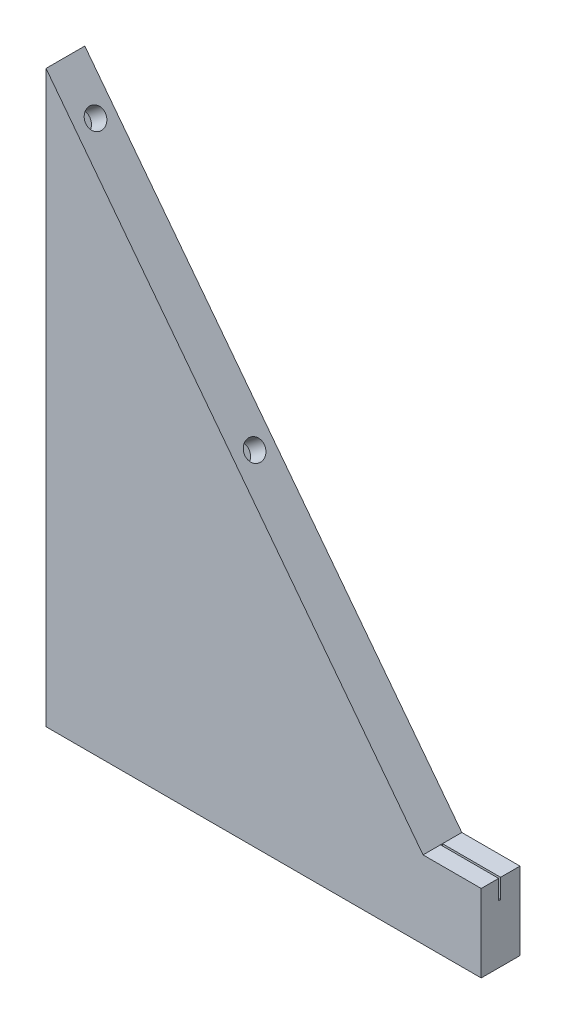
ISO-10303-21;
HEADER;
FILE_DESCRIPTION(('STEP AP214'),'2;1');
FILE_NAME('part.step','',(''),(''),'','','');
FILE_SCHEMA(('AUTOMOTIVE_DESIGN { 1 0 10303 214 1 1 1 1 }'));
ENDSEC;
DATA;
#1=APPLICATION_CONTEXT('core data for automotive mechanical design processes');
#2=APPLICATION_PROTOCOL_DEFINITION('international standard','automotive_design',2000,#1);
#3=PRODUCT_CONTEXT('',#1,'mechanical');
#4=PRODUCT('Part','Part','',(#3));
#5=PRODUCT_RELATED_PRODUCT_CATEGORY('part','',(#4));
#6=PRODUCT_DEFINITION_FORMATION('','',#4);
#7=PRODUCT_DEFINITION_CONTEXT('part definition',#1,'design');
#8=PRODUCT_DEFINITION('design','',#6,#7);
#9=PRODUCT_DEFINITION_SHAPE('','',#8);
#10=(LENGTH_UNIT() NAMED_UNIT(*) SI_UNIT(.MILLI.,.METRE.));
#11=(NAMED_UNIT(*) PLANE_ANGLE_UNIT() SI_UNIT($,.RADIAN.));
#12=(NAMED_UNIT(*) SI_UNIT($,.STERADIAN.) SOLID_ANGLE_UNIT());
#13=UNCERTAINTY_MEASURE_WITH_UNIT(LENGTH_MEASURE(1.E-05),#10,'distance_accuracy_value','');
#14=(GEOMETRIC_REPRESENTATION_CONTEXT(3) GLOBAL_UNCERTAINTY_ASSIGNED_CONTEXT((#13)) GLOBAL_UNIT_ASSIGNED_CONTEXT((#10,
#11,#12)) REPRESENTATION_CONTEXT('',''));
#15=CARTESIAN_POINT('',(0.,0.,0.));
#16=DIRECTION('',(0.,0.,1.));
#17=DIRECTION('',(1.,0.,0.));
#18=AXIS2_PLACEMENT_3D('',#15,#16,#17);
#19=CARTESIAN_POINT('',(61.7516378344647,-67.9802034253826,12.6999999999998));
#20=DIRECTION('',(0.,-1.,0.));
#21=DIRECTION('',(1.,0.,0.));
#22=AXIS2_PLACEMENT_3D('',#19,#20,#21);
#23=PLANE('',#22);
#24=DIRECTION('',(0.,0.,-0.999999999999995));
#25=VECTOR('',#24,1.);
#26=CARTESIAN_POINT('',(61.7516378344647,-67.9802034253826,12.6999999999998));
#27=LINE('',#26,#25);
#28=CARTESIAN_POINT('',(61.751637834465,-67.9802034253823,6.34999999999981));
#29=VERTEX_POINT('',#28);
#30=CARTESIAN_POINT('',(61.7516378344647,-67.9802034253825,-1.52655665885959E-13));
#31=VERTEX_POINT('',#30);
#32=EDGE_CURVE('E92',#29,#31,#27,.T.);
#33=ORIENTED_EDGE('',*,*,#32,.F.);
#34=DIRECTION('',(-1.,0.,0.));
#35=VECTOR('',#34,1.);
#36=CARTESIAN_POINT('',(61.751637834465,-67.9802034253823,6.34999999999981));
#37=LINE('',#36,#35);
#38=CARTESIAN_POINT('',(80.8016378344648,-67.9802034253826,6.34999999999985));
#39=VERTEX_POINT('',#38);
#40=EDGE_CURVE('E165',#39,#29,#37,.T.);
#41=ORIENTED_EDGE('',*,*,#40,.F.);
#42=DIRECTION('',(0.,0.,-0.999999999999995));
#43=VECTOR('',#42,1.);
#44=CARTESIAN_POINT('',(80.8016378344652,-67.9802034253827,12.6999999999998));
#45=LINE('',#44,#43);
#46=CARTESIAN_POINT('',(80.8016378344648,-67.9802034253826,-1.14491749414469E-13));
#47=VERTEX_POINT('',#46);
#48=EDGE_CURVE('E148',#39,#47,#45,.T.);
#49=ORIENTED_EDGE('',*,*,#48,.T.);
#50=DIRECTION('',(-1.,0.,0.));
#51=VECTOR('',#50,1.);
#52=CARTESIAN_POINT('',(61.7516378344647,-67.9802034253825,-1.52655665885959E-13));
#53=LINE('',#52,#51);
#54=EDGE_CURVE('E142',#47,#31,#53,.T.);
#55=ORIENTED_EDGE('',*,*,#54,.T.);
#56=EDGE_LOOP('',(#33,#41,#49,#55));
#57=FACE_BOUND('',#56,.T.);
#58=ADVANCED_FACE('F44',(#57),#23,.F.);
#59=CARTESIAN_POINT('',(61.7516378344647,-67.9802034253826,12.6999999999998));
#60=DIRECTION('',(-0.794096490407309,-0.607791710969138,0.));
#61=DIRECTION('',(0.607791710969143,-0.794096490407309,0.));
#62=AXIS2_PLACEMENT_3D('',#59,#60,#61);
#63=PLANE('',#62);
#64=CARTESIAN_POINT('',(0.,12.7,6.12865130173663));
#65=DIRECTION('',(0.794096490407309,0.607791710969137,0.));
#66=DIRECTION('',(-0.607791710969142,0.79409649040731,0.));
#67=AXIS2_PLACEMENT_3D('',#64,#65,#66);
#68=CIRCLE('',#67,3.175);
#69=CARTESIAN_POINT('',(-1.92973868232704,15.2212563570432,6.12865130173664));
#70=VERTEX_POINT('',#69);
#71=EDGE_CURVE('E180',#70,#70,#68,.T.);
#72=ORIENTED_EDGE('',*,*,#71,.F.);
#73=EDGE_LOOP('',(#72));
#74=FACE_BOUND('',#73,.T.);
#75=CARTESIAN_POINT('',(-52.1029444228296,80.7739216401665,6.12865130173684));
#76=DIRECTION('',(0.794096490407309,0.607791710969137,0.));
#77=DIRECTION('',(-0.607791710969142,0.79409649040731,0.));
#78=AXIS2_PLACEMENT_3D('',#75,#76,#77);
#79=CIRCLE('',#78,3.175);
#80=CARTESIAN_POINT('',(-54.0326831051566,83.2951779972097,6.12865130173687));
#81=VERTEX_POINT('',#80);
#82=EDGE_CURVE('E190',#81,#81,#79,.T.);
#83=ORIENTED_EDGE('',*,*,#82,.F.);
#84=EDGE_LOOP('',(#83));
#85=FACE_BOUND('',#84,.T.);
#86=DIRECTION('',(-0.607791710969143,0.794096490407309,0.));
#87=VECTOR('',#86,1.);
#88=CARTESIAN_POINT('',(61.7516378344647,-67.9802034253825,-1.52655665885959E-13));
#89=LINE('',#88,#87);
#90=CARTESIAN_POINT('',(-61.7516378344649,93.3802034253826,3.43475248243408E-13));
#91=VERTEX_POINT('',#90);
#92=EDGE_CURVE('E133',#31,#91,#89,.T.);
#93=ORIENTED_EDGE('',*,*,#92,.T.);
#94=DIRECTION('',(0.,0.,-0.999999999999995));
#95=VECTOR('',#94,1.);
#96=CARTESIAN_POINT('',(-61.7516378344648,93.3802034253826,12.7000000000003));
#97=LINE('',#96,#95);
#98=CARTESIAN_POINT('',(-61.7516378344648,93.3802034253826,12.7000000000003));
#99=VERTEX_POINT('',#98);
#100=EDGE_CURVE('E13',#99,#91,#97,.T.);
#101=ORIENTED_EDGE('',*,*,#100,.F.);
#102=DIRECTION('',(-0.607791710969143,0.794096490407309,0.));
#103=VECTOR('',#102,1.);
#104=CARTESIAN_POINT('',(61.7516378344647,-67.9802034253826,12.6999999999998));
#105=LINE('',#104,#103);
#106=CARTESIAN_POINT('',(61.7516378344647,-67.9802034253826,12.6999999999998));
#107=VERTEX_POINT('',#106);
#108=EDGE_CURVE('E144',#107,#99,#105,.T.);
#109=ORIENTED_EDGE('',*,*,#108,.F.);
#110=CARTESIAN_POINT('',(61.751637834465,-67.9802034253824,6.98499999999979));
#111=VERTEX_POINT('',#110);
#112=EDGE_CURVE('E145',#107,#111,#27,.T.);
#113=ORIENTED_EDGE('',*,*,#112,.T.);
#114=DIRECTION('',(0.,0.,0.999999999999995));
#115=VECTOR('',#114,1.);
#116=CARTESIAN_POINT('',(61.751637834465,-67.9802034253824,6.98499999999979));
#117=LINE('',#116,#115);
#118=EDGE_CURVE('E59',#29,#111,#117,.T.);
#119=ORIENTED_EDGE('',*,*,#118,.F.);
#120=ORIENTED_EDGE('',*,*,#32,.T.);
#121=EDGE_LOOP('',(#93,#101,#109,#113,#119,#120));
#122=FACE_BOUND('',#121,.T.);
#123=ADVANCED_FACE('F46',(#74,#85,#122),#63,.F.);
#124=CARTESIAN_POINT('',(-61.7516378344648,93.3802034253826,12.7000000000003));
#125=DIRECTION('',(1.,0.,0.));
#126=DIRECTION('',(0.,1.,0.));
#127=AXIS2_PLACEMENT_3D('',#124,#125,#126);
#128=PLANE('',#127);
#129=DIRECTION('',(0.,-1.,0.));
#130=VECTOR('',#129,1.);
#131=CARTESIAN_POINT('',(-61.7516378344649,93.3802034253826,3.43475248243408E-13));
#132=LINE('',#131,#130);
#133=CARTESIAN_POINT('',(-61.7516378344646,-93.3802034253825,-6.10622663543836E-13));
#134=VERTEX_POINT('',#133);
#135=EDGE_CURVE('E135',#91,#134,#132,.T.);
#136=ORIENTED_EDGE('',*,*,#135,.T.);
#137=DIRECTION('',(0.,0.,-0.999999999999995));
#138=VECTOR('',#137,1.);
#139=CARTESIAN_POINT('',(-61.7516378344647,-93.3802034253825,12.6999999999994));
#140=LINE('',#139,#138);
#141=CARTESIAN_POINT('',(-61.7516378344647,-93.3802034253825,12.6999999999994));
#142=VERTEX_POINT('',#141);
#143=EDGE_CURVE('E52',#142,#134,#140,.T.);
#144=ORIENTED_EDGE('',*,*,#143,.F.);
#145=DIRECTION('',(0.,-1.,0.));
#146=VECTOR('',#145,1.);
#147=CARTESIAN_POINT('',(-61.7516378344648,93.3802034253826,12.7000000000003));
#148=LINE('',#147,#146);
#149=EDGE_CURVE('E100',#99,#142,#148,.T.);
#150=ORIENTED_EDGE('',*,*,#149,.F.);
#151=ORIENTED_EDGE('',*,*,#100,.T.);
#152=EDGE_LOOP('',(#136,#144,#150,#151));
#153=FACE_BOUND('',#152,.T.);
#154=ADVANCED_FACE('F149',(#153),#128,.F.);
#155=CARTESIAN_POINT('',(80.8016378344647,-93.3802034253825,12.6999999999997));
#156=DIRECTION('',(0.,1.,0.));
#157=DIRECTION('',(-1.,0.,0.));
#158=AXIS2_PLACEMENT_3D('',#155,#156,#157);
#159=PLANE('',#158);
#160=CARTESIAN_POINT('',(48.099478088129,-93.3802034253826,6.34999999999966));
#161=DIRECTION('',(0.,-1.,0.));
#162=DIRECTION('',(0.,0.,-0.999999999999995));
#163=AXIS2_PLACEMENT_3D('',#160,#161,#162);
#164=CIRCLE('',#163,3.175);
#165=CARTESIAN_POINT('',(48.0994780881289,-93.3802034253825,3.17499999999965));
#166=VERTEX_POINT('',#165);
#167=EDGE_CURVE('E196',#166,#166,#164,.T.);
#168=ORIENTED_EDGE('',*,*,#167,.F.);
#169=EDGE_LOOP('',(#168));
#170=FACE_BOUND('',#169,.T.);
#171=CARTESIAN_POINT('',(-53.5005219118714,-93.3802034253826,6.34999999999943));
#172=DIRECTION('',(0.,-1.,0.));
#173=DIRECTION('',(0.,0.,-0.999999999999995));
#174=AXIS2_PLACEMENT_3D('',#171,#172,#173);
#175=CIRCLE('',#174,3.175);
#176=CARTESIAN_POINT('',(-53.5005219118713,-93.3802034253826,3.17499999999942));
#177=VERTEX_POINT('',#176);
#178=EDGE_CURVE('E202',#177,#177,#175,.T.);
#179=ORIENTED_EDGE('',*,*,#178,.F.);
#180=EDGE_LOOP('',(#179));
#181=FACE_BOUND('',#180,.T.);
#182=DIRECTION('',(1.,0.,0.));
#183=VECTOR('',#182,1.);
#184=CARTESIAN_POINT('',(80.8016378344648,-93.3802034253826,-3.05311331771918E-13));
#185=LINE('',#184,#183);
#186=CARTESIAN_POINT('',(80.8016378344648,-93.3802034253826,-3.05311331771918E-13));
#187=VERTEX_POINT('',#186);
#188=EDGE_CURVE('E119',#134,#187,#185,.T.);
#189=ORIENTED_EDGE('',*,*,#188,.T.);
#190=DIRECTION('',(0.,0.,-0.999999999999995));
#191=VECTOR('',#190,1.);
#192=CARTESIAN_POINT('',(80.8016378344647,-93.3802034253825,12.6999999999997));
#193=LINE('',#192,#191);
#194=CARTESIAN_POINT('',(80.8016378344647,-93.3802034253825,12.6999999999997));
#195=VERTEX_POINT('',#194);
#196=EDGE_CURVE('E117',#195,#187,#193,.T.);
#197=ORIENTED_EDGE('',*,*,#196,.F.);
#198=DIRECTION('',(1.,0.,0.));
#199=VECTOR('',#198,1.);
#200=CARTESIAN_POINT('',(-61.7516378344647,-93.3802034253825,12.6999999999994));
#201=LINE('',#200,#199);
#202=EDGE_CURVE('E107',#142,#195,#201,.T.);
#203=ORIENTED_EDGE('',*,*,#202,.F.);
#204=ORIENTED_EDGE('',*,*,#143,.T.);
#205=EDGE_LOOP('',(#189,#197,#203,#204));
#206=FACE_BOUND('',#205,.T.);
#207=ADVANCED_FACE('F118',(#170,#181,#206),#159,.F.);
#208=CARTESIAN_POINT('',(80.8016378344652,-67.9802034253827,12.6999999999998));
#209=DIRECTION('',(-1.,0.,0.));
#210=DIRECTION('',(0.,0.,0.999999999999995));
#211=AXIS2_PLACEMENT_3D('',#208,#209,#210);
#212=PLANE('',#211);
#213=ORIENTED_EDGE('',*,*,#48,.F.);
#214=DIRECTION('',(0.,1.,0.));
#215=VECTOR('',#214,1.);
#216=CARTESIAN_POINT('',(80.8016378344653,-74.3302034253824,6.34999999999983));
#217=LINE('',#216,#215);
#218=CARTESIAN_POINT('',(80.8016378344653,-74.3302034253824,6.34999999999983));
#219=VERTEX_POINT('',#218);
#220=EDGE_CURVE('E160',#219,#39,#217,.T.);
#221=ORIENTED_EDGE('',*,*,#220,.F.);
#222=DIRECTION('',(0.,0.,-0.999999999999995));
#223=VECTOR('',#222,1.);
#224=CARTESIAN_POINT('',(80.8016378344648,-74.3302034253825,6.98499999999981));
#225=LINE('',#224,#223);
#226=CARTESIAN_POINT('',(80.8016378344648,-74.3302034253825,6.98499999999981));
#227=VERTEX_POINT('',#226);
#228=EDGE_CURVE('E375',#227,#219,#225,.T.);
#229=ORIENTED_EDGE('',*,*,#228,.F.);
#230=DIRECTION('',(0.,1.,0.));
#231=VECTOR('',#230,1.);
#232=CARTESIAN_POINT('',(80.8016378344648,-74.3302034253825,6.98499999999981));
#233=LINE('',#232,#231);
#234=CARTESIAN_POINT('',(80.8016378344653,-67.9802034253828,6.98499999999984));
#235=VERTEX_POINT('',#234);
#236=EDGE_CURVE('E182',#227,#235,#233,.T.);
#237=ORIENTED_EDGE('',*,*,#236,.T.);
#238=CARTESIAN_POINT('',(80.8016378344652,-67.9802034253827,12.6999999999998));
#239=VERTEX_POINT('',#238);
#240=EDGE_CURVE('E123',#239,#235,#45,.T.);
#241=ORIENTED_EDGE('',*,*,#240,.F.);
#242=DIRECTION('',(0.,1.,0.));
#243=VECTOR('',#242,1.);
#244=CARTESIAN_POINT('',(80.8016378344652,-67.9802034253827,12.6999999999998));
#245=LINE('',#244,#243);
#246=EDGE_CURVE('E111',#195,#239,#245,.T.);
#247=ORIENTED_EDGE('',*,*,#246,.F.);
#248=ORIENTED_EDGE('',*,*,#196,.T.);
#249=DIRECTION('',(0.,1.,0.));
#250=VECTOR('',#249,1.);
#251=CARTESIAN_POINT('',(80.8016378344648,-67.9802034253826,-1.14491749414469E-13));
#252=LINE('',#251,#250);
#253=EDGE_CURVE('E140',#187,#47,#252,.T.);
#254=ORIENTED_EDGE('',*,*,#253,.T.);
#255=EDGE_LOOP('',(#213,#221,#229,#237,#241,#247,#248,#254));
#256=FACE_BOUND('',#255,.T.);
#257=ADVANCED_FACE('F126',(#256),#212,.F.);
#258=ORIENTED_EDGE('',*,*,#240,.T.);
#259=DIRECTION('',(1.,0.,0.));
#260=VECTOR('',#259,1.);
#261=CARTESIAN_POINT('',(61.751637834465,-67.9802034253824,6.98499999999979));
#262=LINE('',#261,#260);
#263=EDGE_CURVE('E169',#111,#235,#262,.T.);
#264=ORIENTED_EDGE('',*,*,#263,.F.);
#265=ORIENTED_EDGE('',*,*,#112,.F.);
#266=DIRECTION('',(-1.,0.,0.));
#267=VECTOR('',#266,1.);
#268=CARTESIAN_POINT('',(61.7516378344647,-67.9802034253826,12.6999999999998));
#269=LINE('',#268,#267);
#270=EDGE_CURVE('E68',#239,#107,#269,.T.);
#271=ORIENTED_EDGE('',*,*,#270,.F.);
#272=EDGE_LOOP('',(#258,#264,#265,#271));
#273=FACE_BOUND('',#272,.T.);
#274=ADVANCED_FACE('F217',(#273),#23,.F.);
#275=CARTESIAN_POINT('',(81.1924862012643,-93.3802034253825,12.6999999999997));
#276=DIRECTION('',(0.,0.,-0.999999999999995));
#277=DIRECTION('',(-1.,0.,0.));
#278=AXIS2_PLACEMENT_3D('',#275,#276,#277);
#279=PLANE('',#278);
#280=ORIENTED_EDGE('',*,*,#108,.T.);
#281=ORIENTED_EDGE('',*,*,#149,.T.);
#282=ORIENTED_EDGE('',*,*,#202,.T.);
#283=ORIENTED_EDGE('',*,*,#246,.T.);
#284=ORIENTED_EDGE('',*,*,#270,.T.);
#285=EDGE_LOOP('',(#280,#281,#282,#283,#284));
#286=FACE_BOUND('',#285,.T.);
#287=ADVANCED_FACE('F109',(#286),#279,.F.);
#288=CARTESIAN_POINT('',(81.1924862012643,-93.3802034253826,-2.67147415300428E-13));
#289=DIRECTION('',(0.,0.,-0.999999999999995));
#290=DIRECTION('',(-1.,0.,0.));
#291=AXIS2_PLACEMENT_3D('',#288,#289,#290);
#292=PLANE('',#291);
#293=ORIENTED_EDGE('',*,*,#92,.F.);
#294=ORIENTED_EDGE('',*,*,#54,.F.);
#295=ORIENTED_EDGE('',*,*,#253,.F.);
#296=ORIENTED_EDGE('',*,*,#188,.F.);
#297=ORIENTED_EDGE('',*,*,#135,.F.);
#298=EDGE_LOOP('',(#293,#294,#295,#296,#297));
#299=FACE_BOUND('',#298,.T.);
#300=ADVANCED_FACE('F153',(#299),#292,.T.);
#301=CARTESIAN_POINT('',(-53.5005219118713,-80.6802034253827,6.34999999999947));
#302=DIRECTION('',(0.,-1.,0.));
#303=DIRECTION('',(0.,0.,-0.999999999999995));
#304=AXIS2_PLACEMENT_3D('',#301,#302,#303);
#305=CYLINDRICAL_SURFACE('',#304,3.175);
#306=CARTESIAN_POINT('',(-53.5005219118713,-80.6802034253827,6.34999999999947));
#307=DIRECTION('',(0.,-1.,0.));
#308=DIRECTION('',(0.,0.,-0.999999999999995));
#309=AXIS2_PLACEMENT_3D('',#306,#307,#308);
#310=CIRCLE('',#309,3.175);
#311=CARTESIAN_POINT('',(-53.5005219118714,-80.6802034253827,3.17499999999948));
#312=VERTEX_POINT('',#311);
#313=EDGE_CURVE('E136',#312,#312,#310,.T.);
#314=CARTESIAN_POINT('',(-53.5005219118714,-80.6802034253827,3.17499999999948));
#315=CARTESIAN_POINT('',(-53.5005219118714,-80.8124950920494,3.17499999999948));
#316=CARTESIAN_POINT('',(-53.5005219118714,-80.944786758716,3.17499999999948));
#317=CARTESIAN_POINT('',(-53.5005219118714,-81.2093700920494,3.17499999999948));
#318=CARTESIAN_POINT('',(-53.5005219118714,-81.341661758716,3.17499999999948));
#319=CARTESIAN_POINT('',(-53.5005219118714,-81.6062450920494,3.17499999999948));
#320=CARTESIAN_POINT('',(-53.5005219118714,-81.738536758716,3.17499999999948));
#321=CARTESIAN_POINT('',(-53.5005219118714,-82.0031200920494,3.17499999999948));
#322=CARTESIAN_POINT('',(-53.5005219118714,-82.135411758716,3.17499999999948));
#323=CARTESIAN_POINT('',(-53.5005219118714,-82.3999950920494,3.17499999999947));
#324=CARTESIAN_POINT('',(-53.5005219118714,-82.532286758716,3.17499999999947));
#325=CARTESIAN_POINT('',(-53.5005219118714,-82.7968700920494,3.17499999999947));
#326=CARTESIAN_POINT('',(-53.5005219118714,-82.929161758716,3.17499999999947));
#327=CARTESIAN_POINT('',(-53.5005219118714,-83.1937450920494,3.17499999999947));
#328=CARTESIAN_POINT('',(-53.5005219118714,-83.326036758716,3.17499999999947));
#329=CARTESIAN_POINT('',(-53.5005219118714,-83.5906200920494,3.17499999999947));
#330=CARTESIAN_POINT('',(-53.5005219118713,-83.722911758716,3.17499999999947));
#331=CARTESIAN_POINT('',(-53.5005219118713,-83.9874950920493,3.17499999999947));
#332=CARTESIAN_POINT('',(-53.5005219118713,-84.119786758716,3.17499999999947));
#333=CARTESIAN_POINT('',(-53.5005219118713,-84.3843700920493,3.17499999999947));
#334=CARTESIAN_POINT('',(-53.5005219118713,-84.516661758716,3.17499999999946));
#335=CARTESIAN_POINT('',(-53.5005219118713,-84.7812450920493,3.17499999999946));
#336=CARTESIAN_POINT('',(-53.5005219118713,-84.913536758716,3.17499999999946));
#337=CARTESIAN_POINT('',(-53.5005219118713,-85.1781200920493,3.17499999999946));
#338=CARTESIAN_POINT('',(-53.5005219118713,-85.310411758716,3.17499999999946));
#339=CARTESIAN_POINT('',(-53.5005219118713,-85.5749950920493,3.17499999999946));
#340=CARTESIAN_POINT('',(-53.5005219118713,-85.707286758716,3.17499999999946));
#341=CARTESIAN_POINT('',(-53.5005219118713,-85.9718700920493,3.17499999999946));
#342=CARTESIAN_POINT('',(-53.5005219118713,-86.104161758716,3.17499999999946));
#343=CARTESIAN_POINT('',(-53.5005219118713,-86.3687450920493,3.17499999999946));
#344=CARTESIAN_POINT('',(-53.5005219118713,-86.501036758716,3.17499999999946));
#345=CARTESIAN_POINT('',(-53.5005219118713,-86.7656200920493,3.17499999999945));
#346=CARTESIAN_POINT('',(-53.5005219118713,-86.897911758716,3.17499999999945));
#347=CARTESIAN_POINT('',(-53.5005219118713,-87.1624950920493,3.17499999999945));
#348=CARTESIAN_POINT('',(-53.5005219118713,-87.294786758716,3.17499999999945));
#349=CARTESIAN_POINT('',(-53.5005219118713,-87.5593700920493,3.17499999999945));
#350=CARTESIAN_POINT('',(-53.5005219118713,-87.691661758716,3.17499999999945));
#351=CARTESIAN_POINT('',(-53.5005219118713,-87.9562450920493,3.17499999999945));
#352=CARTESIAN_POINT('',(-53.5005219118713,-88.088536758716,3.17499999999945));
#353=CARTESIAN_POINT('',(-53.5005219118713,-88.3531200920493,3.17499999999945));
#354=CARTESIAN_POINT('',(-53.5005219118713,-88.485411758716,3.17499999999945));
#355=CARTESIAN_POINT('',(-53.5005219118713,-88.7499950920493,3.17499999999944));
#356=CARTESIAN_POINT('',(-53.5005219118713,-88.882286758716,3.17499999999944));
#357=CARTESIAN_POINT('',(-53.5005219118713,-89.1468700920493,3.17499999999944));
#358=CARTESIAN_POINT('',(-53.5005219118713,-89.279161758716,3.17499999999944));
#359=CARTESIAN_POINT('',(-53.5005219118713,-89.5437450920493,3.17499999999944));
#360=CARTESIAN_POINT('',(-53.5005219118713,-89.676036758716,3.17499999999944));
#361=CARTESIAN_POINT('',(-53.5005219118713,-89.9406200920493,3.17499999999944));
#362=CARTESIAN_POINT('',(-53.5005219118713,-90.072911758716,3.17499999999944));
#363=CARTESIAN_POINT('',(-53.5005219118713,-90.3374950920493,3.17499999999944));
#364=CARTESIAN_POINT('',(-53.5005219118713,-90.469786758716,3.17499999999944));
#365=CARTESIAN_POINT('',(-53.5005219118713,-90.7343700920493,3.17499999999943));
#366=CARTESIAN_POINT('',(-53.5005219118713,-90.8666617587159,3.17499999999943));
#367=CARTESIAN_POINT('',(-53.5005219118713,-91.1312450920493,3.17499999999943));
#368=CARTESIAN_POINT('',(-53.5005219118713,-91.2635367587159,3.17499999999943));
#369=CARTESIAN_POINT('',(-53.5005219118713,-91.5281200920493,3.17499999999943));
#370=CARTESIAN_POINT('',(-53.5005219118713,-91.660411758716,3.17499999999943));
#371=CARTESIAN_POINT('',(-53.5005219118713,-91.9249950920493,3.17499999999943));
#372=CARTESIAN_POINT('',(-53.5005219118713,-92.0572867587159,3.17499999999943));
#373=CARTESIAN_POINT('',(-53.5005219118713,-92.3218700920493,3.17499999999943));
#374=CARTESIAN_POINT('',(-53.5005219118713,-92.4541617587159,3.17499999999943));
#375=CARTESIAN_POINT('',(-53.5005219118713,-92.7187450920493,3.17499999999942));
#376=CARTESIAN_POINT('',(-53.5005219118713,-92.8510367587159,3.17499999999942));
#377=CARTESIAN_POINT('',(-53.5005219118713,-93.1156200920493,3.17499999999942));
#378=CARTESIAN_POINT('',(-53.5005219118713,-93.2479117587159,3.17499999999942));
#379=CARTESIAN_POINT('',(-53.5005219118713,-93.3802034253826,3.17499999999942));
#380=B_SPLINE_CURVE_WITH_KNOTS('',3,(#314,#315,#316,#317,#318,#319,#320,#321,#322,#323,#324,
#325,#326,#327,#328,#329,#330,#331,#332,#333,#334,#335,#336,#337,#338,#339,#340,#341,#342,#343,
#344,#345,#346,#347,#348,#349,#350,#351,#352,#353,#354,#355,#356,#357,#358,#359,#360,#361,#362,
#363,#364,#365,#366,#367,#368,#369,#370,#371,#372,#373,#374,#375,#376,#377,#378,#379),
.UNSPECIFIED.,.F.,.F.,(4,2,2,2,2,2,2,2,2,2,2,2,2,2,2,2,2,2,2,2,2,2,2,2,2,2,2,2,2,2,2,2,4),(0.,
0.396874999999991,0.793749999999982,1.19062499999999,1.58749999999998,1.98437499999997,
2.38124999999997,2.77812499999996,3.17499999999997,3.57187499999996,3.96874999999995,
4.36562499999996,4.76249999999995,5.15937499999994,5.55624999999994,5.95312499999993,
6.34999999999993,6.74687499999993,7.14374999999992,7.54062499999993,7.93749999999992,
8.33437499999991,8.73124999999991,9.1281249999999,9.52499999999991,9.9218749999999,
10.3187499999999,10.7156249999999,11.1124999999999,11.5093749999999,11.9062499999999,
12.3031249999999,12.6999999999999),.UNSPECIFIED.);
#381=EDGE_CURVE('BSEAM247',#312,#177,#380,.T.);
#382=ORIENTED_EDGE('',*,*,#313,.F.);
#383=ORIENTED_EDGE('',*,*,#178,.T.);
#384=ORIENTED_EDGE('',*,*,#381,.T.);
#385=ORIENTED_EDGE('',*,*,#381,.F.);
#386=EDGE_LOOP('',(#382,#384,#383,#385));
#387=FACE_BOUND('',#386,.T.);
#388=ADVANCED_FACE('F247',(#387),#305,.F.);
#389=CARTESIAN_POINT('',(-53.5005219118713,-80.6802034253827,6.34999999999947));
#390=DIRECTION('',(0.,-1.,0.));
#391=DIRECTION('',(0.,0.,-0.999999999999995));
#392=AXIS2_PLACEMENT_3D('',#389,#390,#391);
#393=PLANE('',#392);
#394=ORIENTED_EDGE('',*,*,#313,.T.);
#395=EDGE_LOOP('',(#394));
#396=FACE_BOUND('',#395,.T.);
#397=ADVANCED_FACE('F243',(#396),#393,.T.);
#398=CARTESIAN_POINT('',(48.0994780881289,-80.6802034253826,6.34999999999969));
#399=DIRECTION('',(0.,-1.,0.));
#400=DIRECTION('',(0.,0.,-0.999999999999995));
#401=AXIS2_PLACEMENT_3D('',#398,#399,#400);
#402=CYLINDRICAL_SURFACE('',#401,3.175);
#403=CARTESIAN_POINT('',(48.0994780881289,-80.6802034253826,6.34999999999969));
#404=DIRECTION('',(0.,-1.,0.));
#405=DIRECTION('',(0.,0.,-0.999999999999995));
#406=AXIS2_PLACEMENT_3D('',#403,#404,#405);
#407=CIRCLE('',#406,3.175);
#408=CARTESIAN_POINT('',(48.0994780881289,-80.6802034253825,3.17499999999971));
#409=VERTEX_POINT('',#408);
#410=EDGE_CURVE('E199',#409,#409,#407,.T.);
#411=CARTESIAN_POINT('',(48.0994780881289,-80.6802034253825,3.17499999999971));
#412=CARTESIAN_POINT('',(48.0994780881289,-80.8124950920492,3.17499999999971));
#413=CARTESIAN_POINT('',(48.0994780881289,-80.9447867587159,3.17499999999971));
#414=CARTESIAN_POINT('',(48.0994780881289,-81.2093700920492,3.17499999999971));
#415=CARTESIAN_POINT('',(48.0994780881289,-81.3416617587159,3.17499999999971));
#416=CARTESIAN_POINT('',(48.0994780881289,-81.6062450920492,3.17499999999971));
#417=CARTESIAN_POINT('',(48.0994780881289,-81.7385367587159,3.17499999999971));
#418=CARTESIAN_POINT('',(48.0994780881289,-82.0031200920492,3.17499999999971));
#419=CARTESIAN_POINT('',(48.0994780881289,-82.1354117587159,3.1749999999997));
#420=CARTESIAN_POINT('',(48.0994780881289,-82.3999950920492,3.1749999999997));
#421=CARTESIAN_POINT('',(48.0994780881289,-82.5322867587159,3.1749999999997));
#422=CARTESIAN_POINT('',(48.0994780881289,-82.7968700920492,3.1749999999997));
#423=CARTESIAN_POINT('',(48.0994780881289,-82.9291617587159,3.1749999999997));
#424=CARTESIAN_POINT('',(48.0994780881289,-83.1937450920492,3.1749999999997));
#425=CARTESIAN_POINT('',(48.0994780881289,-83.3260367587159,3.1749999999997));
#426=CARTESIAN_POINT('',(48.0994780881289,-83.5906200920492,3.1749999999997));
#427=CARTESIAN_POINT('',(48.0994780881289,-83.7229117587159,3.1749999999997));
#428=CARTESIAN_POINT('',(48.0994780881289,-83.9874950920492,3.1749999999997));
#429=CARTESIAN_POINT('',(48.0994780881289,-84.1197867587159,3.1749999999997));
#430=CARTESIAN_POINT('',(48.0994780881289,-84.3843700920492,3.17499999999969));
#431=CARTESIAN_POINT('',(48.0994780881289,-84.5166617587159,3.17499999999969));
#432=CARTESIAN_POINT('',(48.0994780881289,-84.7812450920492,3.17499999999969));
#433=CARTESIAN_POINT('',(48.0994780881289,-84.9135367587159,3.17499999999969));
#434=CARTESIAN_POINT('',(48.0994780881289,-85.1781200920492,3.17499999999969));
#435=CARTESIAN_POINT('',(48.0994780881289,-85.3104117587159,3.17499999999969));
#436=CARTESIAN_POINT('',(48.0994780881289,-85.5749950920492,3.17499999999969));
#437=CARTESIAN_POINT('',(48.0994780881289,-85.7072867587159,3.17499999999969));
#438=CARTESIAN_POINT('',(48.0994780881289,-85.9718700920492,3.17499999999969));
#439=CARTESIAN_POINT('',(48.0994780881289,-86.1041617587159,3.17499999999969));
#440=CARTESIAN_POINT('',(48.0994780881289,-86.3687450920492,3.17499999999968));
#441=CARTESIAN_POINT('',(48.0994780881289,-86.5010367587159,3.17499999999968));
#442=CARTESIAN_POINT('',(48.0994780881289,-86.7656200920492,3.17499999999968));
#443=CARTESIAN_POINT('',(48.0994780881289,-86.8979117587159,3.17499999999968));
#444=CARTESIAN_POINT('',(48.0994780881289,-87.1624950920492,3.17499999999968));
#445=CARTESIAN_POINT('',(48.0994780881289,-87.2947867587159,3.17499999999968));
#446=CARTESIAN_POINT('',(48.0994780881289,-87.5593700920492,3.17499999999968));
#447=CARTESIAN_POINT('',(48.0994780881289,-87.6916617587159,3.17499999999968));
#448=CARTESIAN_POINT('',(48.0994780881289,-87.9562450920492,3.17499999999968));
#449=CARTESIAN_POINT('',(48.0994780881289,-88.0885367587159,3.17499999999968));
#450=CARTESIAN_POINT('',(48.0994780881289,-88.3531200920492,3.17499999999968));
#451=CARTESIAN_POINT('',(48.0994780881289,-88.4854117587159,3.17499999999967));
#452=CARTESIAN_POINT('',(48.0994780881289,-88.7499950920492,3.17499999999967));
#453=CARTESIAN_POINT('',(48.0994780881289,-88.8822867587159,3.17499999999967));
#454=CARTESIAN_POINT('',(48.0994780881289,-89.1468700920492,3.17499999999967));
#455=CARTESIAN_POINT('',(48.0994780881289,-89.2791617587159,3.17499999999967));
#456=CARTESIAN_POINT('',(48.0994780881289,-89.5437450920492,3.17499999999967));
#457=CARTESIAN_POINT('',(48.0994780881289,-89.6760367587159,3.17499999999967));
#458=CARTESIAN_POINT('',(48.0994780881289,-89.9406200920492,3.17499999999967));
#459=CARTESIAN_POINT('',(48.0994780881289,-90.0729117587159,3.17499999999967));
#460=CARTESIAN_POINT('',(48.0994780881289,-90.3374950920492,3.17499999999966));
#461=CARTESIAN_POINT('',(48.0994780881289,-90.4697867587159,3.17499999999966));
#462=CARTESIAN_POINT('',(48.0994780881289,-90.7343700920492,3.17499999999966));
#463=CARTESIAN_POINT('',(48.0994780881289,-90.8666617587159,3.17499999999966));
#464=CARTESIAN_POINT('',(48.0994780881289,-91.1312450920492,3.17499999999966));
#465=CARTESIAN_POINT('',(48.0994780881289,-91.2635367587159,3.17499999999966));
#466=CARTESIAN_POINT('',(48.0994780881289,-91.5281200920492,3.17499999999966));
#467=CARTESIAN_POINT('',(48.0994780881289,-91.6604117587159,3.17499999999966));
#468=CARTESIAN_POINT('',(48.0994780881289,-91.9249950920492,3.17499999999966));
#469=CARTESIAN_POINT('',(48.0994780881289,-92.0572867587159,3.17499999999966));
#470=CARTESIAN_POINT('',(48.0994780881289,-92.3218700920492,3.17499999999966));
#471=CARTESIAN_POINT('',(48.0994780881289,-92.4541617587159,3.17499999999965));
#472=CARTESIAN_POINT('',(48.0994780881289,-92.7187450920492,3.17499999999965));
#473=CARTESIAN_POINT('',(48.0994780881289,-92.8510367587159,3.17499999999965));
#474=CARTESIAN_POINT('',(48.0994780881289,-93.1156200920492,3.17499999999965));
#475=CARTESIAN_POINT('',(48.0994780881289,-93.2479117587159,3.17499999999965));
#476=CARTESIAN_POINT('',(48.0994780881289,-93.3802034253825,3.17499999999965));
#477=B_SPLINE_CURVE_WITH_KNOTS('',3,(#411,#412,#413,#414,#415,#416,#417,#418,#419,#420,#421,
#422,#423,#424,#425,#426,#427,#428,#429,#430,#431,#432,#433,#434,#435,#436,#437,#438,#439,#440,
#441,#442,#443,#444,#445,#446,#447,#448,#449,#450,#451,#452,#453,#454,#455,#456,#457,#458,#459,
#460,#461,#462,#463,#464,#465,#466,#467,#468,#469,#470,#471,#472,#473,#474,#475,#476),
.UNSPECIFIED.,.F.,.F.,(4,2,2,2,2,2,2,2,2,2,2,2,2,2,2,2,2,2,2,2,2,2,2,2,2,2,2,2,2,2,2,2,4),(0.,
0.396875000000005,0.79375000000001,1.190625,1.58750000000001,1.98437500000001,2.38125,
2.77812500000001,3.17500000000001,3.571875,3.96875000000001,4.36562500000001,4.7625,
5.15937500000001,5.55625000000001,5.953125,6.35000000000001,6.74687500000001,7.14375,
7.54062500000001,7.93750000000001,8.334375,8.73125000000001,9.12812500000001,9.52500000000001,
9.92187500000001,10.31875,10.715625,11.1125,11.509375,11.90625,12.303125,12.7),.UNSPECIFIED.);
#478=EDGE_CURVE('BSEAM235',#409,#166,#477,.T.);
#479=ORIENTED_EDGE('',*,*,#410,.F.);
#480=ORIENTED_EDGE('',*,*,#167,.T.);
#481=ORIENTED_EDGE('',*,*,#478,.T.);
#482=ORIENTED_EDGE('',*,*,#478,.F.);
#483=EDGE_LOOP('',(#479,#481,#480,#482));
#484=FACE_BOUND('',#483,.T.);
#485=ADVANCED_FACE('F235',(#484),#402,.F.);
#486=CARTESIAN_POINT('',(48.0994780881289,-80.6802034253826,6.34999999999969));
#487=DIRECTION('',(0.,-1.,0.));
#488=DIRECTION('',(0.,0.,-0.999999999999995));
#489=AXIS2_PLACEMENT_3D('',#486,#487,#488);
#490=PLANE('',#489);
#491=ORIENTED_EDGE('',*,*,#410,.T.);
#492=EDGE_LOOP('',(#491));
#493=FACE_BOUND('',#492,.T.);
#494=ADVANCED_FACE('F225',(#493),#490,.T.);
#495=CARTESIAN_POINT('',(-57.1454571369163,76.9144442755123,6.12865130173683));
#496=DIRECTION('',(0.794096490407309,0.607791710969137,0.));
#497=DIRECTION('',(-0.607791710969142,0.79409649040731,0.));
#498=AXIS2_PLACEMENT_3D('',#495,#496,#497);
#499=CYLINDRICAL_SURFACE('',#498,3.175);
#500=CARTESIAN_POINT('',(-57.1454571369163,76.9144442755123,6.12865130173683));
#501=DIRECTION('',(0.794096490407309,0.607791710969137,0.));
#502=DIRECTION('',(-0.607791710969142,0.79409649040731,0.));
#503=AXIS2_PLACEMENT_3D('',#500,#501,#502);
#504=CIRCLE('',#503,3.175);
#505=CARTESIAN_POINT('',(-59.0751958192433,79.4357006325555,6.12865130173684));
#506=VERTEX_POINT('',#505);
#507=EDGE_CURVE('E193',#506,#506,#504,.T.);
#508=CARTESIAN_POINT('',(-59.0751958192433,79.4357006325555,6.12865130173684));
#509=CARTESIAN_POINT('',(-59.0226696451382,79.4759035217706,6.12865130173684));
#510=CARTESIAN_POINT('',(-58.9701434710331,79.5161064109858,6.12865130173684));
#511=CARTESIAN_POINT('',(-58.865091122823,79.5965121894161,6.12865130173684));
#512=CARTESIAN_POINT('',(-58.8125649487179,79.6367150786312,6.12865130173684));
#513=CARTESIAN_POINT('',(-58.7075126005078,79.7171208570615,6.12865130173684));
#514=CARTESIAN_POINT('',(-58.6549864264027,79.7573237462767,6.12865130173684));
#515=CARTESIAN_POINT('',(-58.5499340781926,79.837729524707,6.12865130173684));
#516=CARTESIAN_POINT('',(-58.4974079040875,79.8779324139221,6.12865130173684));
#517=CARTESIAN_POINT('',(-58.3923555558774,79.9583381923524,6.12865130173684));
#518=CARTESIAN_POINT('',(-58.3398293817723,79.9985410815676,6.12865130173684));
#519=CARTESIAN_POINT('',(-58.2347770335622,80.0789468599979,6.12865130173684));
#520=CARTESIAN_POINT('',(-58.1822508594571,80.119149749213,6.12865130173684));
#521=CARTESIAN_POINT('',(-58.0771985112469,80.1995555276433,6.12865130173684));
#522=CARTESIAN_POINT('',(-58.0246723371419,80.2397584168585,6.12865130173684));
#523=CARTESIAN_POINT('',(-57.9196199889317,80.3201641952887,6.12865130173684));
#524=CARTESIAN_POINT('',(-57.8670938148267,80.3603670845039,6.12865130173684));
#525=CARTESIAN_POINT('',(-57.7620414666165,80.4407728629342,6.12865130173684));
#526=CARTESIAN_POINT('',(-57.7095152925115,80.4809757521493,6.12865130173684));
#527=CARTESIAN_POINT('',(-57.6044629443013,80.5613815305796,6.12865130173684));
#528=CARTESIAN_POINT('',(-57.5519367701962,80.6015844197948,6.12865130173684));
#529=CARTESIAN_POINT('',(-57.4468844219861,80.6819901982251,6.12865130173684));
#530=CARTESIAN_POINT('',(-57.394358247881,80.7221930874402,6.12865130173684));
#531=CARTESIAN_POINT('',(-57.2893058996709,80.8025988658705,6.12865130173684));
#532=CARTESIAN_POINT('',(-57.2367797255658,80.8428017550857,6.12865130173684));
#533=CARTESIAN_POINT('',(-57.1317273773557,80.923207533516,6.12865130173685));
#534=CARTESIAN_POINT('',(-57.0792012032506,80.9634104227311,6.12865130173685));
#535=CARTESIAN_POINT('',(-56.9741488550405,81.0438162011614,6.12865130173685));
#536=CARTESIAN_POINT('',(-56.9216226809354,81.0840190903766,6.12865130173685));
#537=CARTESIAN_POINT('',(-56.8165703327253,81.1644248688069,6.12865130173685));
#538=CARTESIAN_POINT('',(-56.7640441586202,81.204627758022,6.12865130173685));
#539=CARTESIAN_POINT('',(-56.6589918104101,81.2850335364523,6.12865130173685));
#540=CARTESIAN_POINT('',(-56.606465636305,81.3252364256675,6.12865130173685));
#541=CARTESIAN_POINT('',(-56.5014132880949,81.4056422040978,6.12865130173685));
#542=CARTESIAN_POINT('',(-56.4488871139898,81.4458450933129,6.12865130173685));
#543=CARTESIAN_POINT('',(-56.3438347657796,81.5262508717432,6.12865130173685));
#544=CARTESIAN_POINT('',(-56.2913085916746,81.5664537609584,6.12865130173685));
#545=CARTESIAN_POINT('',(-56.1862562434644,81.6468595393886,6.12865130173685));
#546=CARTESIAN_POINT('',(-56.1337300693594,81.6870624286038,6.12865130173685));
#547=CARTESIAN_POINT('',(-56.0286777211492,81.7674682070341,6.12865130173685));
#548=CARTESIAN_POINT('',(-55.9761515470442,81.8076710962492,6.12865130173685));
#549=CARTESIAN_POINT('',(-55.871099198834,81.8880768746795,6.12865130173685));
#550=CARTESIAN_POINT('',(-55.8185730247289,81.9282797638947,6.12865130173685));
#551=CARTESIAN_POINT('',(-55.7135206765188,82.008685542325,6.12865130173686));
#552=CARTESIAN_POINT('',(-55.6609945024137,82.0488884315401,6.12865130173686));
#553=CARTESIAN_POINT('',(-55.5559421542036,82.1292942099704,6.12865130173686));
#554=CARTESIAN_POINT('',(-55.5034159800985,82.1694970991856,6.12865130173686));
#555=CARTESIAN_POINT('',(-55.3983636318884,82.2499028776159,6.12865130173686));
#556=CARTESIAN_POINT('',(-55.3458374577833,82.290105766831,6.12865130173686));
#557=CARTESIAN_POINT('',(-55.2407851095732,82.3705115452613,6.12865130173686));
#558=CARTESIAN_POINT('',(-55.1882589354681,82.4107144344765,6.12865130173686));
#559=CARTESIAN_POINT('',(-55.083206587258,82.4911202129068,6.12865130173686));
#560=CARTESIAN_POINT('',(-55.0306804131529,82.5313231021219,6.12865130173686));
#561=CARTESIAN_POINT('',(-54.9256280649428,82.6117288805522,6.12865130173686));
#562=CARTESIAN_POINT('',(-54.8731018908377,82.6519317697673,6.12865130173686));
#563=CARTESIAN_POINT('',(-54.7680495426276,82.7323375481976,6.12865130173686));
#564=CARTESIAN_POINT('',(-54.7155233685225,82.7725404374128,6.12865130173686));
#565=CARTESIAN_POINT('',(-54.6104710203124,82.8529462158431,6.12865130173686));
#566=CARTESIAN_POINT('',(-54.5579448462073,82.8931491050582,6.12865130173686));
#567=CARTESIAN_POINT('',(-54.4528924979971,82.9735548834885,6.12865130173686));
#568=CARTESIAN_POINT('',(-54.4003663238921,83.0137577727037,6.12865130173686));
#569=CARTESIAN_POINT('',(-54.2953139756819,83.094163551134,6.12865130173687));
#570=CARTESIAN_POINT('',(-54.2427878015769,83.1343664403491,6.12865130173687));
#571=CARTESIAN_POINT('',(-54.1377354533667,83.2147722187794,6.12865130173687));
#572=CARTESIAN_POINT('',(-54.0852092792616,83.2549751079946,6.12865130173687));
#573=CARTESIAN_POINT('',(-54.0326831051566,83.2951779972097,6.12865130173687));
#574=B_SPLINE_CURVE_WITH_KNOTS('',3,(#508,#509,#510,#511,#512,#513,#514,#515,#516,#517,#518,
#519,#520,#521,#522,#523,#524,#525,#526,#527,#528,#529,#530,#531,#532,#533,#534,#535,#536,#537,
#538,#539,#540,#541,#542,#543,#544,#545,#546,#547,#548,#549,#550,#551,#552,#553,#554,#555,#556,
#557,#558,#559,#560,#561,#562,#563,#564,#565,#566,#567,#568,#569,#570,#571,#572,#573),
.UNSPECIFIED.,.F.,.F.,(4,2,2,2,2,2,2,2,2,2,2,2,2,2,2,2,2,2,2,2,2,2,2,2,2,2,2,2,2,2,2,2,4),(0.,
0.198437500000013,0.396875000000026,0.595312500000039,0.793750000000052,0.99218750000006,
1.19062500000007,1.38906250000008,1.58750000000009,1.7859375000001,1.98437500000011,
2.18281250000012,2.38125000000014,2.57968750000014,2.77812500000015,2.97656250000016,
3.17500000000018,3.37343750000019,3.5718750000002,3.77031250000021,3.96875000000022,
4.16718750000023,4.36562500000024,4.56406250000025,4.76250000000026,4.96093750000028,
5.15937500000028,5.35781250000029,5.5562500000003,5.75468750000032,5.95312500000033,
6.15156250000034,6.35000000000034),.UNSPECIFIED.);
#575=EDGE_CURVE('BSEAM222',#506,#81,#574,.T.);
#576=ORIENTED_EDGE('',*,*,#507,.F.);
#577=ORIENTED_EDGE('',*,*,#82,.T.);
#578=ORIENTED_EDGE('',*,*,#575,.T.);
#579=ORIENTED_EDGE('',*,*,#575,.F.);
#580=EDGE_LOOP('',(#576,#578,#577,#579));
#581=FACE_BOUND('',#580,.T.);
#582=ADVANCED_FACE('F222',(#581),#499,.F.);
#583=CARTESIAN_POINT('',(-57.1454571369163,76.9144442755123,6.12865130173683));
#584=DIRECTION('',(0.794096490407309,0.607791710969137,0.));
#585=DIRECTION('',(-0.607791710969142,0.79409649040731,0.));
#586=AXIS2_PLACEMENT_3D('',#583,#584,#585);
#587=PLANE('',#586);
#588=ORIENTED_EDGE('',*,*,#507,.T.);
#589=EDGE_LOOP('',(#588));
#590=FACE_BOUND('',#589,.T.);
#591=ADVANCED_FACE('F224',(#590),#587,.T.);
#592=CARTESIAN_POINT('',(-5.04251271408644,8.84052263534595,6.1286513017366));
#593=DIRECTION('',(0.794096490407309,0.607791710969137,0.));
#594=DIRECTION('',(-0.607791710969142,0.79409649040731,0.));
#595=AXIS2_PLACEMENT_3D('',#592,#593,#594);
#596=CYLINDRICAL_SURFACE('',#595,3.175);
#597=CARTESIAN_POINT('',(-5.04251271408644,8.84052263534595,6.1286513017366));
#598=DIRECTION('',(0.794096490407309,0.607791710969137,0.));
#599=DIRECTION('',(-0.607791710969142,0.79409649040731,0.));
#600=AXIS2_PLACEMENT_3D('',#597,#598,#599);
#601=CIRCLE('',#600,3.175);
#602=CARTESIAN_POINT('',(-6.97225139641346,11.3617789923892,6.1286513017366));
#603=VERTEX_POINT('',#602);
#604=EDGE_CURVE('E187',#603,#603,#601,.T.);
#605=CARTESIAN_POINT('',(-6.97225139641346,11.3617789923892,6.1286513017366));
#606=CARTESIAN_POINT('',(-6.91972522230839,11.4019818816043,6.1286513017366));
#607=CARTESIAN_POINT('',(-6.86719904820332,11.4421847708195,6.12865130173661));
#608=CARTESIAN_POINT('',(-6.76214669999319,11.5225905492497,6.12865130173661));
#609=CARTESIAN_POINT('',(-6.70962052588812,11.5627934384649,6.12865130173661));
#610=CARTESIAN_POINT('',(-6.60456817767799,11.6431992168952,6.12865130173661));
#611=CARTESIAN_POINT('',(-6.55204200357292,11.6834021061103,6.12865130173661));
#612=CARTESIAN_POINT('',(-6.44698965536279,11.7638078845406,6.12865130173661));
#613=CARTESIAN_POINT('',(-6.39446348125772,11.8040107737558,6.12865130173661));
#614=CARTESIAN_POINT('',(-6.28941113304759,11.8844165521861,6.12865130173661));
#615=CARTESIAN_POINT('',(-6.23688495894252,11.9246194414012,6.12865130173661));
#616=CARTESIAN_POINT('',(-6.13183261073239,12.0050252198315,6.12865130173661));
#617=CARTESIAN_POINT('',(-6.07930643662732,12.0452281090466,6.12865130173661));
#618=CARTESIAN_POINT('',(-5.97425408841719,12.1256338874769,6.12865130173661));
#619=CARTESIAN_POINT('',(-5.92172791431212,12.1658367766921,6.12865130173661));
#620=CARTESIAN_POINT('',(-5.81667556610198,12.2462425551224,6.12865130173661));
#621=CARTESIAN_POINT('',(-5.76414939199692,12.2864454443375,6.12865130173661));
#622=CARTESIAN_POINT('',(-5.65909704378678,12.3668512227678,6.12865130173661));
#623=CARTESIAN_POINT('',(-5.60657086968172,12.407054111983,6.12865130173661));
#624=CARTESIAN_POINT('',(-5.50151852147158,12.4874598904133,6.12865130173661));
#625=CARTESIAN_POINT('',(-5.44899234736652,12.5276627796284,6.12865130173661));
#626=CARTESIAN_POINT('',(-5.34393999915638,12.6080685580587,6.12865130173661));
#627=CARTESIAN_POINT('',(-5.29141382505132,12.6482714472738,6.12865130173661));
#628=CARTESIAN_POINT('',(-5.18636147684118,12.7286772257041,6.12865130173661));
#629=CARTESIAN_POINT('',(-5.13383530273612,12.7688801149193,6.12865130173661));
#630=CARTESIAN_POINT('',(-5.02878295452598,12.8492858933496,6.12865130173662));
#631=CARTESIAN_POINT('',(-4.97625678042092,12.8894887825647,6.12865130173662));
#632=CARTESIAN_POINT('',(-4.87120443221078,12.969894560995,6.12865130173662));
#633=CARTESIAN_POINT('',(-4.81867825810571,13.0100974502102,6.12865130173662));
#634=CARTESIAN_POINT('',(-4.71362590989558,13.0905032286404,6.12865130173662));
#635=CARTESIAN_POINT('',(-4.66109973579051,13.1307061178556,6.12865130173662));
#636=CARTESIAN_POINT('',(-4.55604738758038,13.2111118962859,6.12865130173662));
#637=CARTESIAN_POINT('',(-4.50352121347531,13.251314785501,6.12865130173662));
#638=CARTESIAN_POINT('',(-4.39846886526518,13.3317205639313,6.12865130173662));
#639=CARTESIAN_POINT('',(-4.34594269116011,13.3719234531465,6.12865130173662));
#640=CARTESIAN_POINT('',(-4.24089034294998,13.4523292315768,6.12865130173662));
#641=CARTESIAN_POINT('',(-4.18836416884491,13.4925321207919,6.12865130173662));
#642=CARTESIAN_POINT('',(-4.08331182063478,13.5729378992222,6.12865130173662));
#643=CARTESIAN_POINT('',(-4.03078564652971,13.6131407884373,6.12865130173662));
#644=CARTESIAN_POINT('',(-3.92573329831958,13.6935465668676,6.12865130173662));
#645=CARTESIAN_POINT('',(-3.87320712421451,13.7337494560828,6.12865130173662));
#646=CARTESIAN_POINT('',(-3.76815477600438,13.8141552345131,6.12865130173662));
#647=CARTESIAN_POINT('',(-3.71562860189931,13.8543581237282,6.12865130173662));
#648=CARTESIAN_POINT('',(-3.61057625368918,13.9347639021585,6.12865130173662));
#649=CARTESIAN_POINT('',(-3.55805007958411,13.9749667913737,6.12865130173662));
#650=CARTESIAN_POINT('',(-3.45299773137398,14.055372569804,6.12865130173663));
#651=CARTESIAN_POINT('',(-3.40047155726891,14.0955754590191,6.12865130173663));
#652=CARTESIAN_POINT('',(-3.29541920905878,14.1759812374494,6.12865130173663));
#653=CARTESIAN_POINT('',(-3.24289303495371,14.2161841266645,6.12865130173663));
#654=CARTESIAN_POINT('',(-3.13784068674358,14.2965899050948,6.12865130173663));
#655=CARTESIAN_POINT('',(-3.08531451263851,14.33679279431,6.12865130173663));
#656=CARTESIAN_POINT('',(-2.98026216442837,14.4171985727403,6.12865130173663));
#657=CARTESIAN_POINT('',(-2.92773599032331,14.4574014619554,6.12865130173663));
#658=CARTESIAN_POINT('',(-2.82268364211317,14.5378072403857,6.12865130173663));
#659=CARTESIAN_POINT('',(-2.77015746800811,14.5780101296009,6.12865130173663));
#660=CARTESIAN_POINT('',(-2.66510511979797,14.6584159080311,6.12865130173663));
#661=CARTESIAN_POINT('',(-2.61257894569291,14.6986187972463,6.12865130173663));
#662=CARTESIAN_POINT('',(-2.50752659748277,14.7790245756766,6.12865130173663));
#663=CARTESIAN_POINT('',(-2.45500042337771,14.8192274648917,6.12865130173663));
#664=CARTESIAN_POINT('',(-2.34994807516757,14.899633243322,6.12865130173663));
#665=CARTESIAN_POINT('',(-2.2974219010625,14.9398361325372,6.12865130173663));
#666=CARTESIAN_POINT('',(-2.19236955285237,15.0202419109675,6.12865130173663));
#667=CARTESIAN_POINT('',(-2.1398433787473,15.0604448001826,6.12865130173663));
#668=CARTESIAN_POINT('',(-2.03479103053717,15.1408505786129,6.12865130173663));
#669=CARTESIAN_POINT('',(-1.9822648564321,15.181053467828,6.12865130173663));
#670=CARTESIAN_POINT('',(-1.92973868232704,15.2212563570432,6.12865130173664));
#671=B_SPLINE_CURVE_WITH_KNOTS('',3,(#605,#606,#607,#608,#609,#610,#611,#612,#613,#614,#615,
#616,#617,#618,#619,#620,#621,#622,#623,#624,#625,#626,#627,#628,#629,#630,#631,#632,#633,#634,
#635,#636,#637,#638,#639,#640,#641,#642,#643,#644,#645,#646,#647,#648,#649,#650,#651,#652,#653,
#654,#655,#656,#657,#658,#659,#660,#661,#662,#663,#664,#665,#666,#667,#668,#669,#670),
.UNSPECIFIED.,.F.,.F.,(4,2,2,2,2,2,2,2,2,2,2,2,2,2,2,2,2,2,2,2,2,2,2,2,2,2,2,2,2,2,2,2,4),(0.,
0.1984375,0.396875,0.5953125,0.79375,0.9921875,1.190625,1.3890625,1.5875,1.7859375,1.984375,
2.1828125,2.38125,2.5796875,2.778125,2.9765625,3.175,3.3734375,3.571875,3.7703125,3.96875,
4.1671875,4.365625,4.5640625,4.7625,4.9609375,5.159375,5.3578125,5.55625,5.7546875,5.953125,
6.1515625,6.35),.UNSPECIFIED.);
#672=EDGE_CURVE('BSEAM232',#603,#70,#671,.T.);
#673=ORIENTED_EDGE('',*,*,#604,.F.);
#674=ORIENTED_EDGE('',*,*,#71,.T.);
#675=ORIENTED_EDGE('',*,*,#672,.T.);
#676=ORIENTED_EDGE('',*,*,#672,.F.);
#677=EDGE_LOOP('',(#673,#675,#674,#676));
#678=FACE_BOUND('',#677,.T.);
#679=ADVANCED_FACE('F232',(#678),#596,.F.);
#680=CARTESIAN_POINT('',(-5.04251271408644,8.84052263534595,6.1286513017366));
#681=DIRECTION('',(0.794096490407309,0.607791710969137,0.));
#682=DIRECTION('',(-0.607791710969142,0.79409649040731,0.));
#683=AXIS2_PLACEMENT_3D('',#680,#681,#682);
#684=PLANE('',#683);
#685=ORIENTED_EDGE('',*,*,#604,.T.);
#686=EDGE_LOOP('',(#685));
#687=FACE_BOUND('',#686,.T.);
#688=ADVANCED_FACE('F317',(#687),#684,.T.);
#689=CARTESIAN_POINT('',(61.7516378344651,-74.3302034253827,6.98499999999977));
#690=DIRECTION('',(-1.,0.,0.));
#691=DIRECTION('',(0.,-1.,0.));
#692=AXIS2_PLACEMENT_3D('',#689,#690,#691);
#693=PLANE('',#692);
#694=ORIENTED_EDGE('',*,*,#118,.T.);
#695=DIRECTION('',(0.,1.,0.));
#696=VECTOR('',#695,1.);
#697=CARTESIAN_POINT('',(61.7516378344651,-74.3302034253827,6.98499999999977));
#698=LINE('',#697,#696);
#699=CARTESIAN_POINT('',(61.7516378344651,-74.3302034253827,6.98499999999977));
#700=VERTEX_POINT('',#699);
#701=EDGE_CURVE('E184',#700,#111,#698,.T.);
#702=ORIENTED_EDGE('',*,*,#701,.F.);
#703=DIRECTION('',(0.,0.,0.999999999999995));
#704=VECTOR('',#703,1.);
#705=CARTESIAN_POINT('',(61.7516378344651,-74.3302034253827,6.98499999999977));
#706=LINE('',#705,#704);
#707=CARTESIAN_POINT('',(61.751637834465,-74.3302034253825,6.34999999999977));
#708=VERTEX_POINT('',#707);
#709=EDGE_CURVE('E168',#708,#700,#706,.T.);
#710=ORIENTED_EDGE('',*,*,#709,.F.);
#711=DIRECTION('',(0.,1.,0.));
#712=VECTOR('',#711,1.);
#713=CARTESIAN_POINT('',(61.751637834465,-74.3302034253825,6.34999999999977));
#714=LINE('',#713,#712);
#715=EDGE_CURVE('E178',#708,#29,#714,.T.);
#716=ORIENTED_EDGE('',*,*,#715,.T.);
#717=EDGE_LOOP('',(#694,#702,#710,#716));
#718=FACE_BOUND('',#717,.T.);
#719=ADVANCED_FACE('F324',(#718),#693,.F.);
#720=CARTESIAN_POINT('',(61.751637834465,-74.3302034253825,6.34999999999977));
#721=DIRECTION('',(0.,0.,-0.999999999999995));
#722=DIRECTION('',(-1.,0.,0.));
#723=AXIS2_PLACEMENT_3D('',#720,#721,#722);
#724=PLANE('',#723);
#725=ORIENTED_EDGE('',*,*,#40,.T.);
#726=ORIENTED_EDGE('',*,*,#715,.F.);
#727=DIRECTION('',(-1.,0.,0.));
#728=VECTOR('',#727,1.);
#729=CARTESIAN_POINT('',(61.751637834465,-74.3302034253825,6.34999999999977));
#730=LINE('',#729,#728);
#731=EDGE_CURVE('E186',#219,#708,#730,.T.);
#732=ORIENTED_EDGE('',*,*,#731,.F.);
#733=ORIENTED_EDGE('',*,*,#220,.T.);
#734=EDGE_LOOP('',(#725,#726,#732,#733));
#735=FACE_BOUND('',#734,.T.);
#736=ADVANCED_FACE('F336',(#735),#724,.F.);
#737=CARTESIAN_POINT('',(61.7516378344651,-74.3302034253827,6.98499999999977));
#738=DIRECTION('',(0.,0.,0.999999999999995));
#739=DIRECTION('',(1.,0.,0.));
#740=AXIS2_PLACEMENT_3D('',#737,#738,#739);
#741=PLANE('',#740);
#742=ORIENTED_EDGE('',*,*,#263,.T.);
#743=ORIENTED_EDGE('',*,*,#236,.F.);
#744=DIRECTION('',(1.,0.,0.));
#745=VECTOR('',#744,1.);
#746=CARTESIAN_POINT('',(61.7516378344651,-74.3302034253827,6.98499999999977));
#747=LINE('',#746,#745);
#748=EDGE_CURVE('E172',#700,#227,#747,.T.);
#749=ORIENTED_EDGE('',*,*,#748,.F.);
#750=ORIENTED_EDGE('',*,*,#701,.T.);
#751=EDGE_LOOP('',(#742,#743,#749,#750));
#752=FACE_BOUND('',#751,.T.);
#753=ADVANCED_FACE('F343',(#752),#741,.F.);
#754=CARTESIAN_POINT('',(61.751637834465,-74.3302034253825,6.34999999999977));
#755=DIRECTION('',(0.,-1.,0.));
#756=DIRECTION('',(1.,0.,0.));
#757=AXIS2_PLACEMENT_3D('',#754,#755,#756);
#758=PLANE('',#757);
#759=ORIENTED_EDGE('',*,*,#709,.T.);
#760=ORIENTED_EDGE('',*,*,#748,.T.);
#761=ORIENTED_EDGE('',*,*,#228,.T.);
#762=ORIENTED_EDGE('',*,*,#731,.T.);
#763=EDGE_LOOP('',(#759,#760,#761,#762));
#764=FACE_BOUND('',#763,.T.);
#765=ADVANCED_FACE('F350',(#764),#758,.F.);
#766=CLOSED_SHELL('',(#58,#123,#154,#207,#257,#274,#287,#300,#388,#397,#485,#494,#582,#591,#679,
#688,#719,#736,#753,#765));
#767=MANIFOLD_SOLID_BREP('B2',#766);
#768=ADVANCED_BREP_SHAPE_REPRESENTATION('',(#18,#767),#14);
#769=SHAPE_DEFINITION_REPRESENTATION(#9,#768);
ENDSEC;
END-ISO-10303-21;
